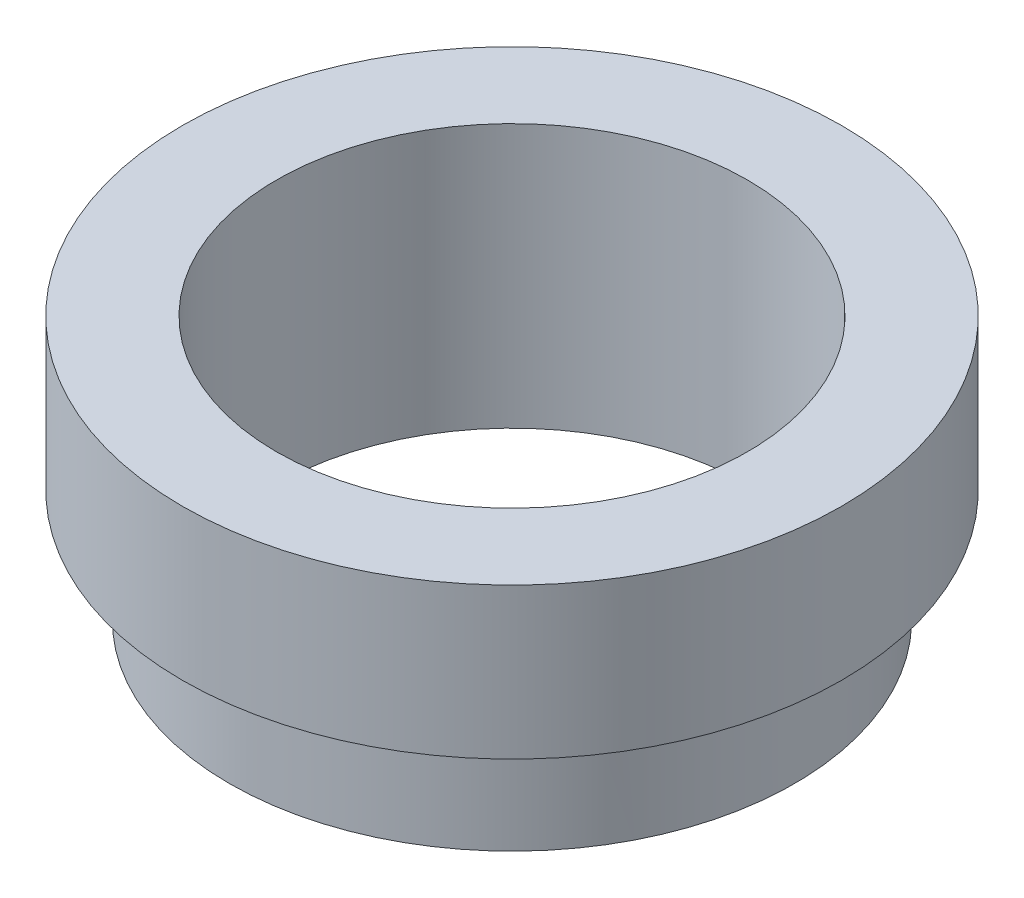
ISO-10303-21;
HEADER;
FILE_DESCRIPTION(('STEP AP214'),'2;1');
FILE_NAME('part.step','',(''),(''),'','','');
FILE_SCHEMA(('AUTOMOTIVE_DESIGN { 1 0 10303 214 1 1 1 1 }'));
ENDSEC;
DATA;
#1=APPLICATION_CONTEXT('core data for automotive mechanical design processes');
#2=APPLICATION_PROTOCOL_DEFINITION('international standard','automotive_design',2000,#1);
#3=PRODUCT_CONTEXT('',#1,'mechanical');
#4=PRODUCT('Part','Part','',(#3));
#5=PRODUCT_RELATED_PRODUCT_CATEGORY('part','',(#4));
#6=PRODUCT_DEFINITION_FORMATION('','',#4);
#7=PRODUCT_DEFINITION_CONTEXT('part definition',#1,'design');
#8=PRODUCT_DEFINITION('design','',#6,#7);
#9=PRODUCT_DEFINITION_SHAPE('','',#8);
#10=(LENGTH_UNIT() NAMED_UNIT(*) SI_UNIT(.MILLI.,.METRE.));
#11=(NAMED_UNIT(*) PLANE_ANGLE_UNIT() SI_UNIT($,.RADIAN.));
#12=(NAMED_UNIT(*) SI_UNIT($,.STERADIAN.) SOLID_ANGLE_UNIT());
#13=UNCERTAINTY_MEASURE_WITH_UNIT(LENGTH_MEASURE(1.E-05),#10,'distance_accuracy_value','');
#14=(GEOMETRIC_REPRESENTATION_CONTEXT(3) GLOBAL_UNCERTAINTY_ASSIGNED_CONTEXT((#13)) GLOBAL_UNIT_ASSIGNED_CONTEXT((#10,
#11,#12)) REPRESENTATION_CONTEXT('',''));
#15=CARTESIAN_POINT('',(0.,0.,0.));
#16=DIRECTION('',(0.,0.,1.));
#17=DIRECTION('',(1.,0.,0.));
#18=AXIS2_PLACEMENT_3D('',#15,#16,#17);
#19=CARTESIAN_POINT('',(0.,0.,0.));
#20=DIRECTION('',(0.,1.,0.));
#21=DIRECTION('',(0.,0.,1.));
#22=AXIS2_PLACEMENT_3D('',#19,#20,#21);
#23=PLANE('',#22);
#24=CARTESIAN_POINT('',(0.,0.,0.));
#25=DIRECTION('',(0.,1.,0.));
#26=DIRECTION('',(0.,0.,1.));
#27=AXIS2_PLACEMENT_3D('',#24,#25,#26);
#28=CIRCLE('',#27,17.5);
#29=CARTESIAN_POINT('',(0.,0.,17.5));
#30=VERTEX_POINT('',#29);
#31=EDGE_CURVE('E42',#30,#30,#28,.T.);
#32=ORIENTED_EDGE('',*,*,#31,.F.);
#33=EDGE_LOOP('',(#32));
#34=FACE_BOUND('',#33,.T.);
#35=CARTESIAN_POINT('',(0.,0.,0.));
#36=DIRECTION('',(0.,1.,0.));
#37=DIRECTION('',(0.,0.,1.));
#38=AXIS2_PLACEMENT_3D('',#35,#36,#37);
#39=CIRCLE('',#38,15.);
#40=CARTESIAN_POINT('',(0.,0.,15.));
#41=VERTEX_POINT('',#40);
#42=EDGE_CURVE('E10',#41,#41,#39,.F.);
#43=ORIENTED_EDGE('',*,*,#42,.F.);
#44=EDGE_LOOP('',(#43));
#45=FACE_BOUND('',#44,.T.);
#46=ADVANCED_FACE('F31',(#34,#45),#23,.F.);
#47=CARTESIAN_POINT('',(0.,8.,0.));
#48=DIRECTION('',(0.,1.,0.));
#49=DIRECTION('',(0.,0.,1.));
#50=AXIS2_PLACEMENT_3D('',#47,#48,#49);
#51=PLANE('',#50);
#52=CARTESIAN_POINT('',(0.,8.,0.));
#53=DIRECTION('',(0.,1.,0.));
#54=DIRECTION('',(0.,0.,1.));
#55=AXIS2_PLACEMENT_3D('',#52,#53,#54);
#56=CIRCLE('',#55,17.5);
#57=CARTESIAN_POINT('',(0.,8.,17.5));
#58=VERTEX_POINT('',#57);
#59=EDGE_CURVE('E38',#58,#58,#56,.T.);
#60=ORIENTED_EDGE('',*,*,#59,.T.);
#61=EDGE_LOOP('',(#60));
#62=FACE_BOUND('',#61,.T.);
#63=CARTESIAN_POINT('',(0.,8.,0.));
#64=DIRECTION('',(0.,1.,0.));
#65=DIRECTION('',(0.,0.,1.));
#66=AXIS2_PLACEMENT_3D('',#63,#64,#65);
#67=CIRCLE('',#66,12.5);
#68=CARTESIAN_POINT('',(0.,8.,12.5));
#69=VERTEX_POINT('',#68);
#70=EDGE_CURVE('E47',#69,#69,#67,.T.);
#71=ORIENTED_EDGE('',*,*,#70,.F.);
#72=EDGE_LOOP('',(#71));
#73=FACE_BOUND('',#72,.T.);
#74=ADVANCED_FACE('F74',(#62,#73),#51,.T.);
#75=CARTESIAN_POINT('',(0.,8.,0.));
#76=DIRECTION('',(0.,-1.,0.));
#77=DIRECTION('',(0.,0.,-1.));
#78=AXIS2_PLACEMENT_3D('',#75,#76,#77);
#79=CYLINDRICAL_SURFACE('',#78,17.5);
#80=ORIENTED_EDGE('',*,*,#59,.F.);
#81=EDGE_LOOP('',(#80));
#82=FACE_BOUND('',#81,.T.);
#83=ORIENTED_EDGE('',*,*,#31,.T.);
#84=EDGE_LOOP('',(#83));
#85=FACE_BOUND('',#84,.T.);
#86=ADVANCED_FACE('F33',(#82,#85),#79,.T.);
#87=CARTESIAN_POINT('',(0.,8.,0.));
#88=DIRECTION('',(0.,-1.,0.));
#89=DIRECTION('',(0.,0.,-1.));
#90=AXIS2_PLACEMENT_3D('',#87,#88,#89);
#91=CYLINDRICAL_SURFACE('',#90,12.5);
#92=ORIENTED_EDGE('',*,*,#70,.T.);
#93=EDGE_LOOP('',(#92));
#94=FACE_BOUND('',#93,.T.);
#95=CARTESIAN_POINT('',(0.,-6.,0.));
#96=DIRECTION('',(0.,-1.,0.));
#97=DIRECTION('',(0.,0.,-1.));
#98=AXIS2_PLACEMENT_3D('',#95,#96,#97);
#99=CIRCLE('',#98,12.5);
#100=CARTESIAN_POINT('',(0.,-6.,-12.5));
#101=VERTEX_POINT('',#100);
#102=EDGE_CURVE('E54',#101,#101,#99,.T.);
#103=ORIENTED_EDGE('',*,*,#102,.T.);
#104=EDGE_LOOP('',(#103));
#105=FACE_BOUND('',#104,.T.);
#106=ADVANCED_FACE('F58',(#94,#105),#91,.F.);
#107=CARTESIAN_POINT('',(0.,-6.,0.));
#108=DIRECTION('',(0.,-1.,0.));
#109=DIRECTION('',(0.,0.,-1.));
#110=AXIS2_PLACEMENT_3D('',#107,#108,#109);
#111=PLANE('',#110);
#112=CARTESIAN_POINT('',(0.,-6.,0.));
#113=DIRECTION('',(0.,-1.,0.));
#114=DIRECTION('',(0.,0.,-1.));
#115=AXIS2_PLACEMENT_3D('',#112,#113,#114);
#116=CIRCLE('',#115,15.);
#117=CARTESIAN_POINT('',(0.,-6.,-15.));
#118=VERTEX_POINT('',#117);
#119=EDGE_CURVE('E51',#118,#118,#116,.T.);
#120=ORIENTED_EDGE('',*,*,#119,.T.);
#121=EDGE_LOOP('',(#120));
#122=FACE_BOUND('',#121,.T.);
#123=ORIENTED_EDGE('',*,*,#102,.F.);
#124=EDGE_LOOP('',(#123));
#125=FACE_BOUND('',#124,.T.);
#126=ADVANCED_FACE('F60',(#122,#125),#111,.T.);
#127=CARTESIAN_POINT('',(0.,-6.,0.));
#128=DIRECTION('',(0.,1.,0.));
#129=DIRECTION('',(0.,0.,1.));
#130=AXIS2_PLACEMENT_3D('',#127,#128,#129);
#131=CYLINDRICAL_SURFACE('',#130,15.);
#132=ORIENTED_EDGE('',*,*,#119,.F.);
#133=EDGE_LOOP('',(#132));
#134=FACE_BOUND('',#133,.T.);
#135=ORIENTED_EDGE('',*,*,#42,.T.);
#136=EDGE_LOOP('',(#135));
#137=FACE_BOUND('',#136,.T.);
#138=ADVANCED_FACE('F62',(#134,#137),#131,.T.);
#139=CLOSED_SHELL('',(#46,#74,#86,#106,#126,#138));
#140=MANIFOLD_SOLID_BREP('B2',#139);
#141=ADVANCED_BREP_SHAPE_REPRESENTATION('',(#18,#140),#14);
#142=SHAPE_DEFINITION_REPRESENTATION(#9,#141);
ENDSEC;
END-ISO-10303-21;
